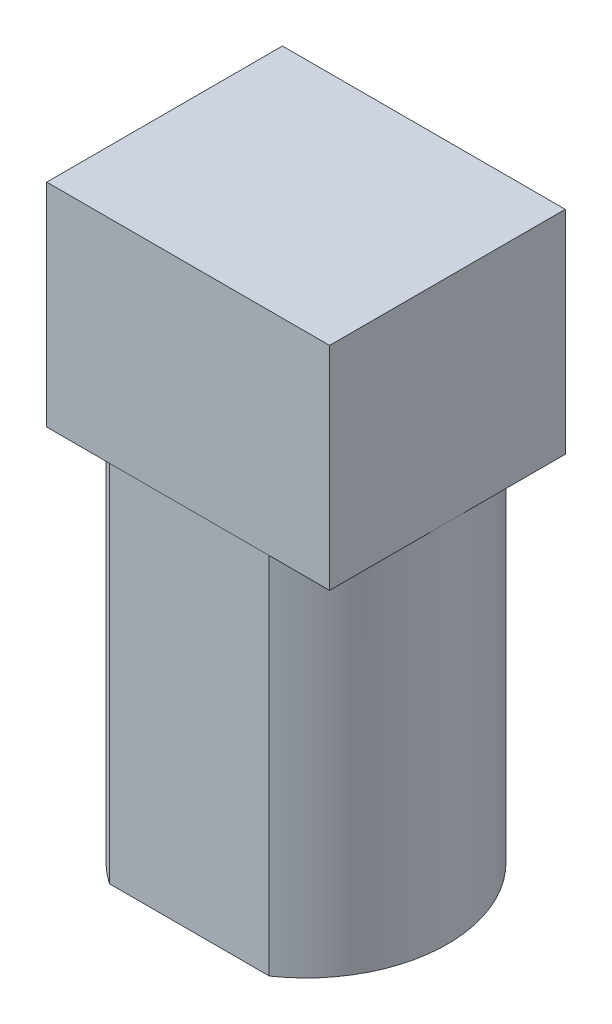
ISO-10303-21;
HEADER;
FILE_DESCRIPTION(('STEP AP214'),'2;1');
FILE_NAME('part.step','',(''),(''),'','','');
FILE_SCHEMA(('AUTOMOTIVE_DESIGN { 1 0 10303 214 1 1 1 1 }'));
ENDSEC;
DATA;
#1=APPLICATION_CONTEXT('core data for automotive mechanical design processes');
#2=APPLICATION_PROTOCOL_DEFINITION('international standard','automotive_design',2000,#1);
#3=PRODUCT_CONTEXT('',#1,'mechanical');
#4=PRODUCT('Part','Part','',(#3));
#5=PRODUCT_RELATED_PRODUCT_CATEGORY('part','',(#4));
#6=PRODUCT_DEFINITION_FORMATION('','',#4);
#7=PRODUCT_DEFINITION_CONTEXT('part definition',#1,'design');
#8=PRODUCT_DEFINITION('design','',#6,#7);
#9=PRODUCT_DEFINITION_SHAPE('','',#8);
#10=(LENGTH_UNIT() NAMED_UNIT(*) SI_UNIT(.MILLI.,.METRE.));
#11=(NAMED_UNIT(*) PLANE_ANGLE_UNIT() SI_UNIT($,.RADIAN.));
#12=(NAMED_UNIT(*) SI_UNIT($,.STERADIAN.) SOLID_ANGLE_UNIT());
#13=UNCERTAINTY_MEASURE_WITH_UNIT(LENGTH_MEASURE(1.E-05),#10,'distance_accuracy_value','');
#14=(GEOMETRIC_REPRESENTATION_CONTEXT(3) GLOBAL_UNCERTAINTY_ASSIGNED_CONTEXT((#13)) GLOBAL_UNIT_ASSIGNED_CONTEXT((#10,
#11,#12)) REPRESENTATION_CONTEXT('',''));
#15=CARTESIAN_POINT('',(0.,0.,0.));
#16=DIRECTION('',(0.,0.,1.));
#17=DIRECTION('',(1.,0.,0.));
#18=AXIS2_PLACEMENT_3D('',#15,#16,#17);
#19=CARTESIAN_POINT('',(0.,15.5,0.));
#20=DIRECTION('',(0.,-1.,0.));
#21=DIRECTION('',(0.,0.,-1.));
#22=AXIS2_PLACEMENT_3D('',#19,#20,#21);
#23=CYLINDRICAL_SURFACE('',#22,6.);
#24=CARTESIAN_POINT('',(0.,0.,0.));
#25=DIRECTION('',(0.,1.,0.));
#26=DIRECTION('',(0.,0.,1.));
#27=AXIS2_PLACEMENT_3D('',#24,#25,#26);
#28=CIRCLE('',#27,6.);
#29=CARTESIAN_POINT('',(-3.39079636663719,0.,-4.95));
#30=VERTEX_POINT('',#29);
#31=CARTESIAN_POINT('',(-3.39079636663719,0.,4.95));
#32=VERTEX_POINT('',#31);
#33=EDGE_CURVE('E133',#30,#32,#28,.T.);
#34=ORIENTED_EDGE('',*,*,#33,.T.);
#35=DIRECTION('',(0.,-1.,0.));
#36=VECTOR('',#35,1.);
#37=CARTESIAN_POINT('',(-3.39079636663719,15.5,4.95));
#38=LINE('',#37,#36);
#39=CARTESIAN_POINT('',(-3.39079636663719,15.5,4.95));
#40=VERTEX_POINT('',#39);
#41=EDGE_CURVE('E11',#40,#32,#38,.T.);
#42=ORIENTED_EDGE('',*,*,#41,.F.);
#43=CARTESIAN_POINT('',(0.,15.5,0.));
#44=DIRECTION('',(0.,1.,0.));
#45=DIRECTION('',(0.,0.,1.));
#46=AXIS2_PLACEMENT_3D('',#43,#44,#45);
#47=CIRCLE('',#46,6.);
#48=CARTESIAN_POINT('',(-6.,15.5,0.));
#49=VERTEX_POINT('',#48);
#50=EDGE_CURVE('E57',#49,#40,#47,.T.);
#51=ORIENTED_EDGE('',*,*,#50,.F.);
#52=CARTESIAN_POINT('',(-3.39079636663719,15.5,-4.95));
#53=VERTEX_POINT('',#52);
#54=EDGE_CURVE('E142',#53,#49,#47,.T.);
#55=ORIENTED_EDGE('',*,*,#54,.F.);
#56=DIRECTION('',(0.,-1.,0.));
#57=VECTOR('',#56,1.);
#58=CARTESIAN_POINT('',(-3.39079636663719,15.5,-4.95));
#59=LINE('',#58,#57);
#60=EDGE_CURVE('E151',#53,#30,#59,.T.);
#61=ORIENTED_EDGE('',*,*,#60,.T.);
#62=EDGE_LOOP('',(#34,#42,#51,#55,#61));
#63=FACE_BOUND('',#62,.T.);
#64=ADVANCED_FACE('F35',(#63),#23,.T.);
#65=CARTESIAN_POINT('',(-3.39079636663719,15.5,4.95));
#66=DIRECTION('',(0.,0.,-1.));
#67=DIRECTION('',(-1.,0.,0.));
#68=AXIS2_PLACEMENT_3D('',#65,#66,#67);
#69=PLANE('',#68);
#70=DIRECTION('',(1.,0.,0.));
#71=VECTOR('',#70,1.);
#72=CARTESIAN_POINT('',(-3.39079636663719,0.,4.95));
#73=LINE('',#72,#71);
#74=CARTESIAN_POINT('',(3.39079636663719,0.,4.95));
#75=VERTEX_POINT('',#74);
#76=EDGE_CURVE('E136',#32,#75,#73,.T.);
#77=ORIENTED_EDGE('',*,*,#76,.T.);
#78=DIRECTION('',(0.,-1.,0.));
#79=VECTOR('',#78,1.);
#80=CARTESIAN_POINT('',(3.39079636663719,15.5,4.95));
#81=LINE('',#80,#79);
#82=CARTESIAN_POINT('',(3.39079636663719,15.5,4.95));
#83=VERTEX_POINT('',#82);
#84=EDGE_CURVE('E42',#83,#75,#81,.T.);
#85=ORIENTED_EDGE('',*,*,#84,.F.);
#86=DIRECTION('',(1.,0.,0.));
#87=VECTOR('',#86,1.);
#88=CARTESIAN_POINT('',(-3.39079636663719,15.5,4.95));
#89=LINE('',#88,#87);
#90=EDGE_CURVE('E144',#40,#83,#89,.T.);
#91=ORIENTED_EDGE('',*,*,#90,.F.);
#92=ORIENTED_EDGE('',*,*,#41,.T.);
#93=EDGE_LOOP('',(#77,#85,#91,#92));
#94=FACE_BOUND('',#93,.T.);
#95=ADVANCED_FACE('F201',(#94),#69,.F.);
#96=CARTESIAN_POINT('',(0.,15.5,0.));
#97=DIRECTION('',(0.,-1.,0.));
#98=DIRECTION('',(0.,0.,-1.));
#99=AXIS2_PLACEMENT_3D('',#96,#97,#98);
#100=CYLINDRICAL_SURFACE('',#99,6.);
#101=CARTESIAN_POINT('',(0.,0.,0.));
#102=DIRECTION('',(0.,1.,0.));
#103=DIRECTION('',(0.,0.,1.));
#104=AXIS2_PLACEMENT_3D('',#101,#102,#103);
#105=CIRCLE('',#104,6.);
#106=CARTESIAN_POINT('',(3.39079636663719,0.,-4.95));
#107=VERTEX_POINT('',#106);
#108=EDGE_CURVE('E154',#75,#107,#105,.T.);
#109=ORIENTED_EDGE('',*,*,#108,.T.);
#110=DIRECTION('',(0.,-1.,0.));
#111=VECTOR('',#110,1.);
#112=CARTESIAN_POINT('',(3.39079636663719,15.5,-4.95));
#113=LINE('',#112,#111);
#114=CARTESIAN_POINT('',(3.39079636663719,15.5,-4.95));
#115=VERTEX_POINT('',#114);
#116=EDGE_CURVE('E160',#115,#107,#113,.T.);
#117=ORIENTED_EDGE('',*,*,#116,.F.);
#118=CARTESIAN_POINT('',(0.,15.5,0.));
#119=DIRECTION('',(0.,1.,0.));
#120=DIRECTION('',(0.,0.,1.));
#121=AXIS2_PLACEMENT_3D('',#118,#119,#120);
#122=CIRCLE('',#121,6.);
#123=CARTESIAN_POINT('',(6.,15.5,0.));
#124=VERTEX_POINT('',#123);
#125=EDGE_CURVE('E49',#124,#115,#122,.T.);
#126=ORIENTED_EDGE('',*,*,#125,.F.);
#127=EDGE_CURVE('E147',#83,#124,#122,.T.);
#128=ORIENTED_EDGE('',*,*,#127,.F.);
#129=ORIENTED_EDGE('',*,*,#84,.T.);
#130=EDGE_LOOP('',(#109,#117,#126,#128,#129));
#131=FACE_BOUND('',#130,.T.);
#132=ADVANCED_FACE('F164',(#131),#100,.T.);
#133=CARTESIAN_POINT('',(-3.39079636663719,15.5,-4.95));
#134=DIRECTION('',(0.,0.,1.));
#135=DIRECTION('',(1.,0.,0.));
#136=AXIS2_PLACEMENT_3D('',#133,#134,#135);
#137=PLANE('',#136);
#138=DIRECTION('',(-1.,0.,0.));
#139=VECTOR('',#138,1.);
#140=CARTESIAN_POINT('',(-3.39079636663719,0.,-4.95));
#141=LINE('',#140,#139);
#142=EDGE_CURVE('E156',#107,#30,#141,.T.);
#143=ORIENTED_EDGE('',*,*,#142,.T.);
#144=ORIENTED_EDGE('',*,*,#60,.F.);
#145=DIRECTION('',(-1.,0.,0.));
#146=VECTOR('',#145,1.);
#147=CARTESIAN_POINT('',(-3.39079636663719,15.5,-4.95));
#148=LINE('',#147,#146);
#149=EDGE_CURVE('E149',#115,#53,#148,.T.);
#150=ORIENTED_EDGE('',*,*,#149,.F.);
#151=ORIENTED_EDGE('',*,*,#116,.T.);
#152=EDGE_LOOP('',(#143,#144,#150,#151));
#153=FACE_BOUND('',#152,.T.);
#154=ADVANCED_FACE('F172',(#153),#137,.F.);
#155=CARTESIAN_POINT('',(0.,0.,0.));
#156=DIRECTION('',(0.,1.,0.));
#157=DIRECTION('',(0.,0.,1.));
#158=AXIS2_PLACEMENT_3D('',#155,#156,#157);
#159=PLANE('',#158);
#160=ORIENTED_EDGE('',*,*,#33,.F.);
#161=ORIENTED_EDGE('',*,*,#142,.F.);
#162=ORIENTED_EDGE('',*,*,#108,.F.);
#163=ORIENTED_EDGE('',*,*,#76,.F.);
#164=EDGE_LOOP('',(#160,#161,#162,#163));
#165=FACE_BOUND('',#164,.T.);
#166=ADVANCED_FACE('F169',(#165),#159,.F.);
#167=CARTESIAN_POINT('',(0.,15.5,0.));
#168=DIRECTION('',(0.,-1.,0.));
#169=DIRECTION('',(0.,0.,-1.));
#170=AXIS2_PLACEMENT_3D('',#167,#168,#169);
#171=PLANE('',#170);
#172=ORIENTED_EDGE('',*,*,#149,.T.);
#173=ORIENTED_EDGE('',*,*,#54,.T.);
#174=DIRECTION('',(0.,0.,1.));
#175=VECTOR('',#174,1.);
#176=CARTESIAN_POINT('',(-6.,15.5,5.));
#177=LINE('',#176,#175);
#178=CARTESIAN_POINT('',(-6.,15.5,-5.));
#179=VERTEX_POINT('',#178);
#180=EDGE_CURVE('E178',#179,#49,#177,.T.);
#181=ORIENTED_EDGE('',*,*,#180,.F.);
#182=DIRECTION('',(-1.,0.,0.));
#183=VECTOR('',#182,1.);
#184=CARTESIAN_POINT('',(-6.,15.5,-5.));
#185=LINE('',#184,#183);
#186=CARTESIAN_POINT('',(6.,15.5,-5.));
#187=VERTEX_POINT('',#186);
#188=EDGE_CURVE('E126',#187,#179,#185,.T.);
#189=ORIENTED_EDGE('',*,*,#188,.F.);
#190=DIRECTION('',(0.,0.,-1.));
#191=VECTOR('',#190,1.);
#192=CARTESIAN_POINT('',(6.,15.5,5.));
#193=LINE('',#192,#191);
#194=EDGE_CURVE('E185',#124,#187,#193,.T.);
#195=ORIENTED_EDGE('',*,*,#194,.F.);
#196=ORIENTED_EDGE('',*,*,#125,.T.);
#197=EDGE_LOOP('',(#172,#173,#181,#189,#195,#196));
#198=FACE_BOUND('',#197,.T.);
#199=ADVANCED_FACE('F176',(#198),#171,.T.);
#200=CARTESIAN_POINT('',(-6.,24.5,5.));
#201=DIRECTION('',(1.,0.,0.));
#202=DIRECTION('',(0.,0.,-1.));
#203=AXIS2_PLACEMENT_3D('',#200,#201,#202);
#204=PLANE('',#203);
#205=ORIENTED_EDGE('',*,*,#180,.T.);
#206=CARTESIAN_POINT('',(-6.,15.5,5.));
#207=VERTEX_POINT('',#206);
#208=EDGE_CURVE('E131',#49,#207,#177,.T.);
#209=ORIENTED_EDGE('',*,*,#208,.T.);
#210=DIRECTION('',(0.,-1.,0.));
#211=VECTOR('',#210,1.);
#212=CARTESIAN_POINT('',(-6.,24.5,5.));
#213=LINE('',#212,#211);
#214=CARTESIAN_POINT('',(-6.,24.5,5.));
#215=VERTEX_POINT('',#214);
#216=EDGE_CURVE('E111',#215,#207,#213,.T.);
#217=ORIENTED_EDGE('',*,*,#216,.F.);
#218=DIRECTION('',(0.,0.,1.));
#219=VECTOR('',#218,1.);
#220=CARTESIAN_POINT('',(-6.,24.5,5.));
#221=LINE('',#220,#219);
#222=CARTESIAN_POINT('',(-6.,24.5,-5.));
#223=VERTEX_POINT('',#222);
#224=EDGE_CURVE('E117',#223,#215,#221,.T.);
#225=ORIENTED_EDGE('',*,*,#224,.F.);
#226=DIRECTION('',(0.,-1.,0.));
#227=VECTOR('',#226,1.);
#228=CARTESIAN_POINT('',(-6.,24.5,-5.));
#229=LINE('',#228,#227);
#230=EDGE_CURVE('E184',#223,#179,#229,.T.);
#231=ORIENTED_EDGE('',*,*,#230,.T.);
#232=EDGE_LOOP('',(#205,#209,#217,#225,#231));
#233=FACE_BOUND('',#232,.T.);
#234=ADVANCED_FACE('F129',(#233),#204,.F.);
#235=CARTESIAN_POINT('',(-6.,24.5,5.));
#236=DIRECTION('',(0.,0.,-1.));
#237=DIRECTION('',(-1.,0.,0.));
#238=AXIS2_PLACEMENT_3D('',#235,#236,#237);
#239=PLANE('',#238);
#240=DIRECTION('',(1.,0.,0.));
#241=VECTOR('',#240,1.);
#242=CARTESIAN_POINT('',(-6.,15.5,5.));
#243=LINE('',#242,#241);
#244=CARTESIAN_POINT('',(6.,15.5,5.));
#245=VERTEX_POINT('',#244);
#246=EDGE_CURVE('E182',#207,#245,#243,.T.);
#247=ORIENTED_EDGE('',*,*,#246,.T.);
#248=DIRECTION('',(0.,-1.,0.));
#249=VECTOR('',#248,1.);
#250=CARTESIAN_POINT('',(6.,24.5,5.));
#251=LINE('',#250,#249);
#252=CARTESIAN_POINT('',(6.,24.5,5.));
#253=VERTEX_POINT('',#252);
#254=EDGE_CURVE('E113',#253,#245,#251,.T.);
#255=ORIENTED_EDGE('',*,*,#254,.F.);
#256=DIRECTION('',(1.,0.,0.));
#257=VECTOR('',#256,1.);
#258=CARTESIAN_POINT('',(-6.,24.5,5.));
#259=LINE('',#258,#257);
#260=EDGE_CURVE('E107',#215,#253,#259,.T.);
#261=ORIENTED_EDGE('',*,*,#260,.F.);
#262=ORIENTED_EDGE('',*,*,#216,.T.);
#263=EDGE_LOOP('',(#247,#255,#261,#262));
#264=FACE_BOUND('',#263,.T.);
#265=ADVANCED_FACE('F109',(#264),#239,.F.);
#266=CARTESIAN_POINT('',(6.,24.5,5.));
#267=DIRECTION('',(-1.,0.,0.));
#268=DIRECTION('',(0.,0.,1.));
#269=AXIS2_PLACEMENT_3D('',#266,#267,#268);
#270=PLANE('',#269);
#271=EDGE_CURVE('E190',#245,#124,#193,.T.);
#272=ORIENTED_EDGE('',*,*,#271,.T.);
#273=ORIENTED_EDGE('',*,*,#194,.T.);
#274=DIRECTION('',(0.,-1.,0.));
#275=VECTOR('',#274,1.);
#276=CARTESIAN_POINT('',(6.,24.5,-5.));
#277=LINE('',#276,#275);
#278=CARTESIAN_POINT('',(6.,24.5,-5.));
#279=VERTEX_POINT('',#278);
#280=EDGE_CURVE('E138',#279,#187,#277,.T.);
#281=ORIENTED_EDGE('',*,*,#280,.F.);
#282=DIRECTION('',(0.,0.,-1.));
#283=VECTOR('',#282,1.);
#284=CARTESIAN_POINT('',(6.,24.5,5.));
#285=LINE('',#284,#283);
#286=EDGE_CURVE('E116',#253,#279,#285,.T.);
#287=ORIENTED_EDGE('',*,*,#286,.F.);
#288=ORIENTED_EDGE('',*,*,#254,.T.);
#289=EDGE_LOOP('',(#272,#273,#281,#287,#288));
#290=FACE_BOUND('',#289,.T.);
#291=ADVANCED_FACE('F200',(#290),#270,.F.);
#292=CARTESIAN_POINT('',(-6.,24.5,-5.));
#293=DIRECTION('',(0.,0.,1.));
#294=DIRECTION('',(1.,0.,0.));
#295=AXIS2_PLACEMENT_3D('',#292,#293,#294);
#296=PLANE('',#295);
#297=ORIENTED_EDGE('',*,*,#188,.T.);
#298=ORIENTED_EDGE('',*,*,#230,.F.);
#299=DIRECTION('',(-1.,0.,0.));
#300=VECTOR('',#299,1.);
#301=CARTESIAN_POINT('',(-6.,24.5,-5.));
#302=LINE('',#301,#300);
#303=EDGE_CURVE('E122',#279,#223,#302,.T.);
#304=ORIENTED_EDGE('',*,*,#303,.F.);
#305=ORIENTED_EDGE('',*,*,#280,.T.);
#306=EDGE_LOOP('',(#297,#298,#304,#305));
#307=FACE_BOUND('',#306,.T.);
#308=ADVANCED_FACE('F197',(#307),#296,.F.);
#309=CARTESIAN_POINT('',(0.,24.5,0.));
#310=DIRECTION('',(0.,-1.,0.));
#311=DIRECTION('',(0.,0.,-1.));
#312=AXIS2_PLACEMENT_3D('',#309,#310,#311);
#313=PLANE('',#312);
#314=ORIENTED_EDGE('',*,*,#224,.T.);
#315=ORIENTED_EDGE('',*,*,#260,.T.);
#316=ORIENTED_EDGE('',*,*,#286,.T.);
#317=ORIENTED_EDGE('',*,*,#303,.T.);
#318=EDGE_LOOP('',(#314,#315,#316,#317));
#319=FACE_BOUND('',#318,.T.);
#320=ADVANCED_FACE('F120',(#319),#313,.F.);
#321=ORIENTED_EDGE('',*,*,#208,.F.);
#322=ORIENTED_EDGE('',*,*,#50,.T.);
#323=ORIENTED_EDGE('',*,*,#90,.T.);
#324=ORIENTED_EDGE('',*,*,#127,.T.);
#325=ORIENTED_EDGE('',*,*,#271,.F.);
#326=ORIENTED_EDGE('',*,*,#246,.F.);
#327=EDGE_LOOP('',(#321,#322,#323,#324,#325,#326));
#328=FACE_BOUND('',#327,.T.);
#329=ADVANCED_FACE('F180',(#328),#171,.T.);
#330=CLOSED_SHELL('',(#64,#95,#132,#154,#166,#199,#234,#265,#291,#308,#320,#329));
#331=MANIFOLD_SOLID_BREP('B2',#330);
#332=ADVANCED_BREP_SHAPE_REPRESENTATION('',(#18,#331),#14);
#333=SHAPE_DEFINITION_REPRESENTATION(#9,#332);
ENDSEC;
END-ISO-10303-21;
